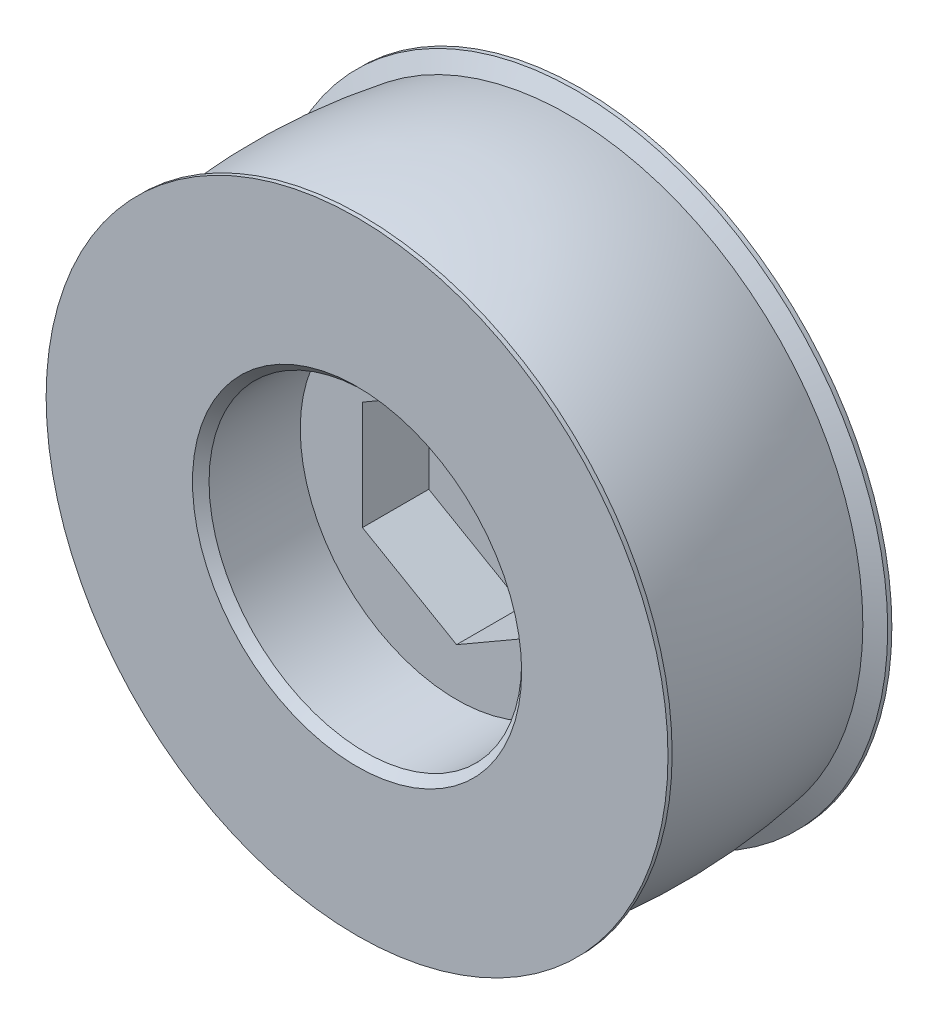
ISO-10303-21;
HEADER;
FILE_DESCRIPTION(('STEP AP214'),'2;1');
FILE_NAME('part.step','',(''),(''),'','','');
FILE_SCHEMA(('AUTOMOTIVE_DESIGN { 1 0 10303 214 1 1 1 1 }'));
ENDSEC;
DATA;
#1=APPLICATION_CONTEXT('core data for automotive mechanical design processes');
#2=APPLICATION_PROTOCOL_DEFINITION('international standard','automotive_design',2000,#1);
#3=PRODUCT_CONTEXT('',#1,'mechanical');
#4=PRODUCT('Part','Part','',(#3));
#5=PRODUCT_RELATED_PRODUCT_CATEGORY('part','',(#4));
#6=PRODUCT_DEFINITION_FORMATION('','',#4);
#7=PRODUCT_DEFINITION_CONTEXT('part definition',#1,'design');
#8=PRODUCT_DEFINITION('design','',#6,#7);
#9=PRODUCT_DEFINITION_SHAPE('','',#8);
#10=(LENGTH_UNIT() NAMED_UNIT(*) SI_UNIT(.MILLI.,.METRE.));
#11=(NAMED_UNIT(*) PLANE_ANGLE_UNIT() SI_UNIT($,.RADIAN.));
#12=(NAMED_UNIT(*) SI_UNIT($,.STERADIAN.) SOLID_ANGLE_UNIT());
#13=UNCERTAINTY_MEASURE_WITH_UNIT(LENGTH_MEASURE(1.E-05),#10,'distance_accuracy_value','');
#14=(GEOMETRIC_REPRESENTATION_CONTEXT(3) GLOBAL_UNCERTAINTY_ASSIGNED_CONTEXT((#13)) GLOBAL_UNIT_ASSIGNED_CONTEXT((#10,
#11,#12)) REPRESENTATION_CONTEXT('',''));
#15=CARTESIAN_POINT('',(0.,0.,0.));
#16=DIRECTION('',(0.,0.,1.));
#17=DIRECTION('',(1.,0.,0.));
#18=AXIS2_PLACEMENT_3D('',#15,#16,#17);
#19=CARTESIAN_POINT('',(0.,-8.,27.));
#20=DIRECTION('',(0.,0.,-1.));
#21=DIRECTION('',(-1.,0.,0.));
#22=AXIS2_PLACEMENT_3D('',#19,#20,#21);
#23=CYLINDRICAL_SURFACE('',#22,1.25);
#24=CARTESIAN_POINT('',(0.,-8.,7.));
#25=DIRECTION('',(0.,0.,1.));
#26=DIRECTION('',(1.,0.,0.));
#27=AXIS2_PLACEMENT_3D('',#24,#25,#26);
#28=CIRCLE('',#27,1.25);
#29=CARTESIAN_POINT('',(1.24999999999992,-8.,7.));
#30=VERTEX_POINT('',#29);
#31=EDGE_CURVE('E160',#30,#30,#28,.T.);
#32=ORIENTED_EDGE('',*,*,#31,.T.);
#33=EDGE_LOOP('',(#32));
#34=FACE_BOUND('',#33,.T.);
#35=CARTESIAN_POINT('',(0.,-8.,4.));
#36=DIRECTION('',(0.,0.,-1.));
#37=DIRECTION('',(-1.,0.,0.));
#38=AXIS2_PLACEMENT_3D('',#35,#36,#37);
#39=CIRCLE('',#38,1.25);
#40=CARTESIAN_POINT('',(-1.25000000000008,-8.,4.));
#41=VERTEX_POINT('',#40);
#42=EDGE_CURVE('E39',#41,#41,#39,.F.);
#43=ORIENTED_EDGE('',*,*,#42,.F.);
#44=EDGE_LOOP('',(#43));
#45=FACE_BOUND('',#44,.T.);
#46=ADVANCED_FACE('F35',(#34,#45),#23,.F.);
#47=CARTESIAN_POINT('',(-6.92820323027551,4.,27.));
#48=DIRECTION('',(0.,0.,-1.));
#49=DIRECTION('',(-1.,0.,0.));
#50=AXIS2_PLACEMENT_3D('',#47,#48,#49);
#51=CYLINDRICAL_SURFACE('',#50,1.25);
#52=CARTESIAN_POINT('',(-6.92820323027551,4.,7.));
#53=DIRECTION('',(0.,0.,1.));
#54=DIRECTION('',(1.,0.,0.));
#55=AXIS2_PLACEMENT_3D('',#52,#53,#54);
#56=CIRCLE('',#55,1.25);
#57=CARTESIAN_POINT('',(-5.67820323027551,4.,7.));
#58=VERTEX_POINT('',#57);
#59=EDGE_CURVE('E159',#58,#58,#56,.T.);
#60=ORIENTED_EDGE('',*,*,#59,.T.);
#61=EDGE_LOOP('',(#60));
#62=FACE_BOUND('',#61,.T.);
#63=CARTESIAN_POINT('',(-6.92820323027551,4.,4.));
#64=DIRECTION('',(0.,0.,-1.));
#65=DIRECTION('',(-1.,0.,0.));
#66=AXIS2_PLACEMENT_3D('',#63,#64,#65);
#67=CIRCLE('',#66,1.25);
#68=CARTESIAN_POINT('',(-8.17820323027551,4.,4.));
#69=VERTEX_POINT('',#68);
#70=EDGE_CURVE('E168',#69,#69,#67,.F.);
#71=ORIENTED_EDGE('',*,*,#70,.F.);
#72=EDGE_LOOP('',(#71));
#73=FACE_BOUND('',#72,.T.);
#74=ADVANCED_FACE('F230',(#62,#73),#51,.F.);
#75=CARTESIAN_POINT('',(6.92820323027553,3.99999999999996,27.));
#76=DIRECTION('',(0.,0.,-1.));
#77=DIRECTION('',(-1.,0.,0.));
#78=AXIS2_PLACEMENT_3D('',#75,#76,#77);
#79=CYLINDRICAL_SURFACE('',#78,1.25);
#80=CARTESIAN_POINT('',(6.92820323027553,3.99999999999996,7.));
#81=DIRECTION('',(0.,0.,1.));
#82=DIRECTION('',(1.,0.,0.));
#83=AXIS2_PLACEMENT_3D('',#80,#81,#82);
#84=CIRCLE('',#83,1.25);
#85=CARTESIAN_POINT('',(8.17820323027553,3.99999999999996,7.));
#86=VERTEX_POINT('',#85);
#87=EDGE_CURVE('E155',#86,#86,#84,.T.);
#88=ORIENTED_EDGE('',*,*,#87,.T.);
#89=EDGE_LOOP('',(#88));
#90=FACE_BOUND('',#89,.T.);
#91=CARTESIAN_POINT('',(6.92820323027553,3.99999999999996,4.));
#92=DIRECTION('',(0.,0.,-1.));
#93=DIRECTION('',(-1.,0.,0.));
#94=AXIS2_PLACEMENT_3D('',#91,#92,#93);
#95=CIRCLE('',#94,1.25);
#96=CARTESIAN_POINT('',(5.67820323027553,3.99999999999996,4.));
#97=VERTEX_POINT('',#96);
#98=EDGE_CURVE('E163',#97,#97,#95,.F.);
#99=ORIENTED_EDGE('',*,*,#98,.F.);
#100=EDGE_LOOP('',(#99));
#101=FACE_BOUND('',#100,.T.);
#102=ADVANCED_FACE('F236',(#90,#101),#79,.F.);
#103=CARTESIAN_POINT('',(0.,0.,15.));
#104=DIRECTION('',(0.,0.,-1.));
#105=DIRECTION('',(-1.,0.,0.));
#106=AXIS2_PLACEMENT_3D('',#103,#104,#105);
#107=CYLINDRICAL_SURFACE('',#106,37.5);
#108=CARTESIAN_POINT('',(0.,0.,26.5));
#109=DIRECTION('',(0.,0.,-1.));
#110=DIRECTION('',(-1.,0.,0.));
#111=AXIS2_PLACEMENT_3D('',#108,#109,#110);
#112=CIRCLE('',#111,37.5);
#113=CARTESIAN_POINT('',(-37.5,0.,26.5));
#114=VERTEX_POINT('',#113);
#115=EDGE_CURVE('E201',#114,#114,#112,.T.);
#116=ORIENTED_EDGE('',*,*,#115,.F.);
#117=EDGE_LOOP('',(#116));
#118=FACE_BOUND('',#117,.T.);
#119=CARTESIAN_POINT('',(0.,0.,27.));
#120=DIRECTION('',(0.,0.,1.));
#121=DIRECTION('',(1.,0.,0.));
#122=AXIS2_PLACEMENT_3D('',#119,#120,#121);
#123=CIRCLE('',#122,37.5);
#124=CARTESIAN_POINT('',(37.5,0.,27.));
#125=VERTEX_POINT('',#124);
#126=EDGE_CURVE('E139',#125,#125,#123,.T.);
#127=ORIENTED_EDGE('',*,*,#126,.F.);
#128=EDGE_LOOP('',(#127));
#129=FACE_BOUND('',#128,.T.);
#130=ADVANCED_FACE('F244',(#118,#129),#107,.T.);
#131=CARTESIAN_POINT('',(0.,0.,15.));
#132=DIRECTION('',(0.,0.,-1.));
#133=DIRECTION('',(-1.,0.,0.));
#134=AXIS2_PLACEMENT_3D('',#131,#132,#133);
#135=CYLINDRICAL_SURFACE('',#134,3.25);
#136=CARTESIAN_POINT('',(0.,0.,0.));
#137=DIRECTION('',(0.,0.,1.));
#138=DIRECTION('',(1.,0.,0.));
#139=AXIS2_PLACEMENT_3D('',#136,#137,#138);
#140=CIRCLE('',#139,3.25);
#141=CARTESIAN_POINT('',(3.25,0.,0.));
#142=VERTEX_POINT('',#141);
#143=EDGE_CURVE('E142',#142,#142,#140,.T.);
#144=ORIENTED_EDGE('',*,*,#143,.F.);
#145=EDGE_LOOP('',(#144));
#146=FACE_BOUND('',#145,.T.);
#147=CARTESIAN_POINT('',(0.,0.,7.));
#148=DIRECTION('',(0.,0.,1.));
#149=DIRECTION('',(1.,0.,0.));
#150=AXIS2_PLACEMENT_3D('',#147,#148,#149);
#151=CIRCLE('',#150,3.25);
#152=CARTESIAN_POINT('',(3.25,0.,7.));
#153=VERTEX_POINT('',#152);
#154=EDGE_CURVE('E138',#153,#153,#151,.T.);
#155=ORIENTED_EDGE('',*,*,#154,.T.);
#156=EDGE_LOOP('',(#155));
#157=FACE_BOUND('',#156,.T.);
#158=ADVANCED_FACE('F281',(#146,#157),#135,.F.);
#159=CARTESIAN_POINT('',(0.,0.,15.));
#160=DIRECTION('',(0.,0.,1.));
#161=DIRECTION('',(1.,0.,0.));
#162=AXIS2_PLACEMENT_3D('',#159,#160,#161);
#163=PLANE('',#162);
#164=DIRECTION('',(0.866025403784439,0.5,0.));
#165=VECTOR('',#164,1.);
#166=CARTESIAN_POINT('',(0.,-13.1058511106045,15.));
#167=LINE('',#166,#165);
#168=CARTESIAN_POINT('',(0.,-13.1058511106045,15.));
#169=VERTEX_POINT('',#168);
#170=CARTESIAN_POINT('',(11.35,-6.55292555530226,15.));
#171=VERTEX_POINT('',#170);
#172=EDGE_CURVE('E52',#169,#171,#167,.T.);
#173=ORIENTED_EDGE('',*,*,#172,.F.);
#174=DIRECTION('',(0.866025403784439,-0.5,0.));
#175=VECTOR('',#174,1.);
#176=CARTESIAN_POINT('',(-11.35,-6.55292555530225,15.));
#177=LINE('',#176,#175);
#178=CARTESIAN_POINT('',(-11.35,-6.55292555530225,15.));
#179=VERTEX_POINT('',#178);
#180=EDGE_CURVE('E126',#179,#169,#177,.T.);
#181=ORIENTED_EDGE('',*,*,#180,.F.);
#182=DIRECTION('',(0.,-1.,0.));
#183=VECTOR('',#182,1.);
#184=CARTESIAN_POINT('',(-11.35,6.55292555530226,15.));
#185=LINE('',#184,#183);
#186=CARTESIAN_POINT('',(-11.35,6.55292555530226,15.));
#187=VERTEX_POINT('',#186);
#188=EDGE_CURVE('E120',#187,#179,#185,.T.);
#189=ORIENTED_EDGE('',*,*,#188,.F.);
#190=DIRECTION('',(-0.866025403784439,-0.5,0.));
#191=VECTOR('',#190,1.);
#192=CARTESIAN_POINT('',(0.,13.1058511106045,15.));
#193=LINE('',#192,#191);
#194=CARTESIAN_POINT('',(0.,13.1058511106045,15.));
#195=VERTEX_POINT('',#194);
#196=EDGE_CURVE('E118',#195,#187,#193,.T.);
#197=ORIENTED_EDGE('',*,*,#196,.F.);
#198=DIRECTION('',(-0.866025403784439,0.5,0.));
#199=VECTOR('',#198,1.);
#200=CARTESIAN_POINT('',(11.35,6.55292555530226,15.));
#201=LINE('',#200,#199);
#202=CARTESIAN_POINT('',(11.35,6.55292555530226,15.));
#203=VERTEX_POINT('',#202);
#204=EDGE_CURVE('E103',#203,#195,#201,.T.);
#205=ORIENTED_EDGE('',*,*,#204,.F.);
#206=DIRECTION('',(0.,1.,0.));
#207=VECTOR('',#206,1.);
#208=CARTESIAN_POINT('',(11.35,-6.55292555530226,15.));
#209=LINE('',#208,#207);
#210=EDGE_CURVE('E110',#171,#203,#209,.T.);
#211=ORIENTED_EDGE('',*,*,#210,.F.);
#212=EDGE_LOOP('',(#173,#181,#189,#197,#205,#211));
#213=FACE_BOUND('',#212,.T.);
#214=CARTESIAN_POINT('',(0.,0.,15.));
#215=DIRECTION('',(0.,0.,1.));
#216=DIRECTION('',(1.,0.,0.));
#217=AXIS2_PLACEMENT_3D('',#214,#215,#216);
#218=CIRCLE('',#217,18.85);
#219=CARTESIAN_POINT('',(18.85,0.,15.));
#220=VERTEX_POINT('',#219);
#221=EDGE_CURVE('E148',#220,#220,#218,.F.);
#222=ORIENTED_EDGE('',*,*,#221,.F.);
#223=EDGE_LOOP('',(#222));
#224=FACE_BOUND('',#223,.T.);
#225=ADVANCED_FACE('F114',(#213,#224),#163,.T.);
#226=CARTESIAN_POINT('',(0.,0.,0.));
#227=DIRECTION('',(0.,0.,1.));
#228=DIRECTION('',(1.,0.,0.));
#229=AXIS2_PLACEMENT_3D('',#226,#227,#228);
#230=PLANE('',#229);
#231=CARTESIAN_POINT('',(-6.92820323027551,4.,0.));
#232=DIRECTION('',(0.,0.,-1.));
#233=DIRECTION('',(-1.,0.,0.));
#234=AXIS2_PLACEMENT_3D('',#231,#232,#233);
#235=CIRCLE('',#234,4.25);
#236=CARTESIAN_POINT('',(-11.1782032302755,4.,0.));
#237=VERTEX_POINT('',#236);
#238=EDGE_CURVE('E176',#237,#237,#235,.T.);
#239=ORIENTED_EDGE('',*,*,#238,.F.);
#240=EDGE_LOOP('',(#239));
#241=FACE_BOUND('',#240,.T.);
#242=CARTESIAN_POINT('',(0.,-8.,0.));
#243=DIRECTION('',(0.,0.,-1.));
#244=DIRECTION('',(-1.,0.,0.));
#245=AXIS2_PLACEMENT_3D('',#242,#243,#244);
#246=CIRCLE('',#245,4.25);
#247=CARTESIAN_POINT('',(-4.25000000000008,-8.,0.));
#248=VERTEX_POINT('',#247);
#249=EDGE_CURVE('E186',#248,#248,#246,.T.);
#250=ORIENTED_EDGE('',*,*,#249,.F.);
#251=EDGE_LOOP('',(#250));
#252=FACE_BOUND('',#251,.T.);
#253=CARTESIAN_POINT('',(6.92820323027553,3.99999999999996,0.));
#254=DIRECTION('',(0.,0.,-1.));
#255=DIRECTION('',(-1.,0.,0.));
#256=AXIS2_PLACEMENT_3D('',#253,#254,#255);
#257=CIRCLE('',#256,4.25);
#258=CARTESIAN_POINT('',(2.67820323027553,3.99999999999996,0.));
#259=VERTEX_POINT('',#258);
#260=EDGE_CURVE('E174',#259,#259,#257,.T.);
#261=ORIENTED_EDGE('',*,*,#260,.F.);
#262=EDGE_LOOP('',(#261));
#263=FACE_BOUND('',#262,.T.);
#264=CARTESIAN_POINT('',(0.,0.,0.));
#265=DIRECTION('',(0.,0.,1.));
#266=DIRECTION('',(1.,0.,0.));
#267=AXIS2_PLACEMENT_3D('',#264,#265,#266);
#268=CIRCLE('',#267,37.5);
#269=CARTESIAN_POINT('',(37.5,0.,0.));
#270=VERTEX_POINT('',#269);
#271=EDGE_CURVE('E145',#270,#270,#268,.T.);
#272=ORIENTED_EDGE('',*,*,#271,.F.);
#273=EDGE_LOOP('',(#272));
#274=FACE_BOUND('',#273,.T.);
#275=ORIENTED_EDGE('',*,*,#143,.T.);
#276=EDGE_LOOP('',(#275));
#277=FACE_BOUND('',#276,.T.);
#278=ADVANCED_FACE('F287',(#241,#252,#263,#274,#277),#230,.F.);
#279=CARTESIAN_POINT('',(0.,0.,0.5));
#280=DIRECTION('',(0.,0.,-1.));
#281=DIRECTION('',(-1.,0.,0.));
#282=AXIS2_PLACEMENT_3D('',#279,#280,#281);
#283=CIRCLE('',#282,37.5);
#284=CARTESIAN_POINT('',(-37.5,0.,0.5));
#285=VERTEX_POINT('',#284);
#286=EDGE_CURVE('E198',#285,#285,#283,.T.);
#287=ORIENTED_EDGE('',*,*,#286,.T.);
#288=EDGE_LOOP('',(#287));
#289=FACE_BOUND('',#288,.T.);
#290=ORIENTED_EDGE('',*,*,#271,.T.);
#291=EDGE_LOOP('',(#290));
#292=FACE_BOUND('',#291,.T.);
#293=ADVANCED_FACE('F279',(#289,#292),#107,.T.);
#294=CARTESIAN_POINT('',(0.,0.,27.));
#295=DIRECTION('',(0.,0.,1.));
#296=DIRECTION('',(1.,0.,0.));
#297=AXIS2_PLACEMENT_3D('',#294,#295,#296);
#298=PLANE('',#297);
#299=CARTESIAN_POINT('',(0.,0.,27.));
#300=DIRECTION('',(0.,0.,1.));
#301=DIRECTION('',(1.,0.,0.));
#302=AXIS2_PLACEMENT_3D('',#299,#300,#301);
#303=CIRCLE('',#302,19.85);
#304=CARTESIAN_POINT('',(19.85,0.,27.));
#305=VERTEX_POINT('',#304);
#306=EDGE_CURVE('E12',#305,#305,#303,.F.);
#307=ORIENTED_EDGE('',*,*,#306,.T.);
#308=EDGE_LOOP('',(#307));
#309=FACE_BOUND('',#308,.T.);
#310=ORIENTED_EDGE('',*,*,#126,.T.);
#311=EDGE_LOOP('',(#310));
#312=FACE_BOUND('',#311,.T.);
#313=ADVANCED_FACE('F272',(#309,#312),#298,.T.);
#314=CARTESIAN_POINT('',(0.,0.,27.));
#315=DIRECTION('',(0.,0.,-1.));
#316=DIRECTION('',(-1.,0.,0.));
#317=AXIS2_PLACEMENT_3D('',#314,#315,#316);
#318=CYLINDRICAL_SURFACE('',#317,18.85);
#319=CARTESIAN_POINT('',(0.,0.,26.));
#320=DIRECTION('',(0.,0.,1.));
#321=DIRECTION('',(1.,0.,0.));
#322=AXIS2_PLACEMENT_3D('',#319,#320,#321);
#323=CIRCLE('',#322,18.85);
#324=CARTESIAN_POINT('',(18.85,0.,26.));
#325=VERTEX_POINT('',#324);
#326=EDGE_CURVE('E44',#325,#325,#323,.T.);
#327=ORIENTED_EDGE('',*,*,#326,.T.);
#328=EDGE_LOOP('',(#327));
#329=FACE_BOUND('',#328,.T.);
#330=ORIENTED_EDGE('',*,*,#221,.T.);
#331=EDGE_LOOP('',(#330));
#332=FACE_BOUND('',#331,.T.);
#333=ADVANCED_FACE('F267',(#329,#332),#318,.F.);
#334=CARTESIAN_POINT('',(0.,-13.1058511106045,-34.6748227584992));
#335=DIRECTION('',(0.5,-0.866025403784439,0.));
#336=DIRECTION('',(0.866025403784439,0.5,0.));
#337=AXIS2_PLACEMENT_3D('',#334,#335,#336);
#338=PLANE('',#337);
#339=DIRECTION('',(-0.866025403784439,-0.5,0.));
#340=VECTOR('',#339,1.);
#341=CARTESIAN_POINT('',(0.,-13.1058511106045,7.));
#342=LINE('',#341,#340);
#343=CARTESIAN_POINT('',(11.35,-6.55292555530226,7.));
#344=VERTEX_POINT('',#343);
#345=CARTESIAN_POINT('',(0.,-13.1058511106045,7.));
#346=VERTEX_POINT('',#345);
#347=EDGE_CURVE('E71',#344,#346,#342,.T.);
#348=ORIENTED_EDGE('',*,*,#347,.T.);
#349=DIRECTION('',(0.,0.,1.));
#350=VECTOR('',#349,1.);
#351=CARTESIAN_POINT('',(0.,-13.1058511106045,-34.6748227584992));
#352=LINE('',#351,#350);
#353=EDGE_CURVE('E129',#346,#169,#352,.T.);
#354=ORIENTED_EDGE('',*,*,#353,.T.);
#355=ORIENTED_EDGE('',*,*,#172,.T.);
#356=DIRECTION('',(0.,0.,1.));
#357=VECTOR('',#356,1.);
#358=CARTESIAN_POINT('',(11.35,-6.55292555530226,-34.6748227584992));
#359=LINE('',#358,#357);
#360=EDGE_CURVE('E107',#344,#171,#359,.T.);
#361=ORIENTED_EDGE('',*,*,#360,.F.);
#362=EDGE_LOOP('',(#348,#354,#355,#361));
#363=FACE_BOUND('',#362,.T.);
#364=ADVANCED_FACE('F263',(#363),#338,.F.);
#365=CARTESIAN_POINT('',(-11.35,-6.55292555530225,-34.6748227584992));
#366=DIRECTION('',(-0.5,-0.866025403784439,0.));
#367=DIRECTION('',(0.866025403784439,-0.5,0.));
#368=AXIS2_PLACEMENT_3D('',#365,#366,#367);
#369=PLANE('',#368);
#370=DIRECTION('',(-0.866025403784439,0.5,0.));
#371=VECTOR('',#370,1.);
#372=CARTESIAN_POINT('',(-11.35,-6.55292555530225,7.));
#373=LINE('',#372,#371);
#374=CARTESIAN_POINT('',(-11.35,-6.55292555530225,7.));
#375=VERTEX_POINT('',#374);
#376=EDGE_CURVE('E208',#346,#375,#373,.T.);
#377=ORIENTED_EDGE('',*,*,#376,.T.);
#378=DIRECTION('',(0.,0.,1.));
#379=VECTOR('',#378,1.);
#380=CARTESIAN_POINT('',(-11.35,-6.55292555530225,-34.6748227584992));
#381=LINE('',#380,#379);
#382=EDGE_CURVE('E131',#375,#179,#381,.T.);
#383=ORIENTED_EDGE('',*,*,#382,.T.);
#384=ORIENTED_EDGE('',*,*,#180,.T.);
#385=ORIENTED_EDGE('',*,*,#353,.F.);
#386=EDGE_LOOP('',(#377,#383,#384,#385));
#387=FACE_BOUND('',#386,.T.);
#388=ADVANCED_FACE('F213',(#387),#369,.F.);
#389=CARTESIAN_POINT('',(-11.35,6.55292555530226,-34.6748227584992));
#390=DIRECTION('',(-1.,0.,0.));
#391=DIRECTION('',(0.,-1.,0.));
#392=AXIS2_PLACEMENT_3D('',#389,#390,#391);
#393=PLANE('',#392);
#394=DIRECTION('',(0.,1.,0.));
#395=VECTOR('',#394,1.);
#396=CARTESIAN_POINT('',(-11.35,6.55292555530226,7.));
#397=LINE('',#396,#395);
#398=CARTESIAN_POINT('',(-11.35,6.55292555530226,7.));
#399=VERTEX_POINT('',#398);
#400=EDGE_CURVE('E206',#375,#399,#397,.T.);
#401=ORIENTED_EDGE('',*,*,#400,.T.);
#402=DIRECTION('',(0.,0.,1.));
#403=VECTOR('',#402,1.);
#404=CARTESIAN_POINT('',(-11.35,6.55292555530226,-34.6748227584992));
#405=LINE('',#404,#403);
#406=EDGE_CURVE('E133',#399,#187,#405,.T.);
#407=ORIENTED_EDGE('',*,*,#406,.T.);
#408=ORIENTED_EDGE('',*,*,#188,.T.);
#409=ORIENTED_EDGE('',*,*,#382,.F.);
#410=EDGE_LOOP('',(#401,#407,#408,#409));
#411=FACE_BOUND('',#410,.T.);
#412=ADVANCED_FACE('F218',(#411),#393,.F.);
#413=CARTESIAN_POINT('',(0.,13.1058511106045,-34.6748227584992));
#414=DIRECTION('',(-0.5,0.866025403784439,0.));
#415=DIRECTION('',(-0.866025403784439,-0.5,0.));
#416=AXIS2_PLACEMENT_3D('',#413,#414,#415);
#417=PLANE('',#416);
#418=DIRECTION('',(0.866025403784439,0.5,0.));
#419=VECTOR('',#418,1.);
#420=CARTESIAN_POINT('',(0.,13.1058511106045,7.));
#421=LINE('',#420,#419);
#422=CARTESIAN_POINT('',(0.,13.1058511106045,7.));
#423=VERTEX_POINT('',#422);
#424=EDGE_CURVE('E61',#399,#423,#421,.T.);
#425=ORIENTED_EDGE('',*,*,#424,.T.);
#426=DIRECTION('',(0.,0.,1.));
#427=VECTOR('',#426,1.);
#428=CARTESIAN_POINT('',(0.,13.1058511106045,-34.6748227584992));
#429=LINE('',#428,#427);
#430=EDGE_CURVE('E106',#423,#195,#429,.T.);
#431=ORIENTED_EDGE('',*,*,#430,.T.);
#432=ORIENTED_EDGE('',*,*,#196,.T.);
#433=ORIENTED_EDGE('',*,*,#406,.F.);
#434=EDGE_LOOP('',(#425,#431,#432,#433));
#435=FACE_BOUND('',#434,.T.);
#436=ADVANCED_FACE('F220',(#435),#417,.F.);
#437=CARTESIAN_POINT('',(11.35,6.55292555530226,-34.6748227584992));
#438=DIRECTION('',(0.5,0.866025403784439,0.));
#439=DIRECTION('',(-0.866025403784439,0.5,0.));
#440=AXIS2_PLACEMENT_3D('',#437,#438,#439);
#441=PLANE('',#440);
#442=DIRECTION('',(0.866025403784439,-0.5,0.));
#443=VECTOR('',#442,1.);
#444=CARTESIAN_POINT('',(11.35,6.55292555530226,7.));
#445=LINE('',#444,#443);
#446=CARTESIAN_POINT('',(11.35,6.55292555530226,7.));
#447=VERTEX_POINT('',#446);
#448=EDGE_CURVE('E105',#423,#447,#445,.T.);
#449=ORIENTED_EDGE('',*,*,#448,.T.);
#450=DIRECTION('',(0.,0.,1.));
#451=VECTOR('',#450,1.);
#452=CARTESIAN_POINT('',(11.35,6.55292555530226,-34.6748227584992));
#453=LINE('',#452,#451);
#454=EDGE_CURVE('E98',#447,#203,#453,.T.);
#455=ORIENTED_EDGE('',*,*,#454,.T.);
#456=ORIENTED_EDGE('',*,*,#204,.T.);
#457=ORIENTED_EDGE('',*,*,#430,.F.);
#458=EDGE_LOOP('',(#449,#455,#456,#457));
#459=FACE_BOUND('',#458,.T.);
#460=ADVANCED_FACE('F100',(#459),#441,.F.);
#461=CARTESIAN_POINT('',(11.35,-6.55292555530226,-34.6748227584992));
#462=DIRECTION('',(1.,0.,0.));
#463=DIRECTION('',(0.,1.,0.));
#464=AXIS2_PLACEMENT_3D('',#461,#462,#463);
#465=PLANE('',#464);
#466=DIRECTION('',(0.,-1.,0.));
#467=VECTOR('',#466,1.);
#468=CARTESIAN_POINT('',(11.35,-6.55292555530226,7.));
#469=LINE('',#468,#467);
#470=EDGE_CURVE('E80',#447,#344,#469,.T.);
#471=ORIENTED_EDGE('',*,*,#470,.T.);
#472=ORIENTED_EDGE('',*,*,#360,.T.);
#473=ORIENTED_EDGE('',*,*,#210,.T.);
#474=ORIENTED_EDGE('',*,*,#454,.F.);
#475=EDGE_LOOP('',(#471,#472,#473,#474));
#476=FACE_BOUND('',#475,.T.);
#477=ADVANCED_FACE('F111',(#476),#465,.F.);
#478=CARTESIAN_POINT('',(0.,0.,7.));
#479=DIRECTION('',(0.,0.,1.));
#480=DIRECTION('',(1.,0.,0.));
#481=AXIS2_PLACEMENT_3D('',#478,#479,#480);
#482=PLANE('',#481);
#483=ORIENTED_EDGE('',*,*,#59,.F.);
#484=EDGE_LOOP('',(#483));
#485=FACE_BOUND('',#484,.T.);
#486=ORIENTED_EDGE('',*,*,#31,.F.);
#487=EDGE_LOOP('',(#486));
#488=FACE_BOUND('',#487,.T.);
#489=ORIENTED_EDGE('',*,*,#87,.F.);
#490=EDGE_LOOP('',(#489));
#491=FACE_BOUND('',#490,.T.);
#492=ORIENTED_EDGE('',*,*,#154,.F.);
#493=EDGE_LOOP('',(#492));
#494=FACE_BOUND('',#493,.T.);
#495=ORIENTED_EDGE('',*,*,#347,.F.);
#496=ORIENTED_EDGE('',*,*,#470,.F.);
#497=ORIENTED_EDGE('',*,*,#448,.F.);
#498=ORIENTED_EDGE('',*,*,#424,.F.);
#499=ORIENTED_EDGE('',*,*,#400,.F.);
#500=ORIENTED_EDGE('',*,*,#376,.F.);
#501=EDGE_LOOP('',(#495,#496,#497,#498,#499,#500));
#502=FACE_BOUND('',#501,.T.);
#503=ADVANCED_FACE('F216',(#485,#488,#491,#494,#502),#482,.T.);
#504=CARTESIAN_POINT('',(0.,0.,26.));
#505=DIRECTION('',(0.,0.,1.));
#506=DIRECTION('',(1.,0.,0.));
#507=AXIS2_PLACEMENT_3D('',#504,#505,#506);
#508=CONICAL_SURFACE('',#507,18.85,0.78539816339745);
#509=ORIENTED_EDGE('',*,*,#306,.F.);
#510=EDGE_LOOP('',(#509));
#511=FACE_BOUND('',#510,.T.);
#512=ORIENTED_EDGE('',*,*,#326,.F.);
#513=EDGE_LOOP('',(#512));
#514=FACE_BOUND('',#513,.T.);
#515=ADVANCED_FACE('F37',(#511,#514),#508,.F.);
#516=CARTESIAN_POINT('',(0.,0.,26.5));
#517=DIRECTION('',(0.,0.,1.));
#518=DIRECTION('',(1.,0.,0.));
#519=AXIS2_PLACEMENT_3D('',#516,#517,#518);
#520=CONICAL_SURFACE('',#519,37.5,1.10714871779409);
#521=CARTESIAN_POINT('',(0.,0.,25.5));
#522=DIRECTION('',(0.,0.,-1.));
#523=DIRECTION('',(-1.,0.,0.));
#524=AXIS2_PLACEMENT_3D('',#521,#522,#523);
#525=CIRCLE('',#524,35.5);
#526=CARTESIAN_POINT('',(-35.5,0.,25.5));
#527=VERTEX_POINT('',#526);
#528=EDGE_CURVE('E158',#527,#527,#525,.T.);
#529=ORIENTED_EDGE('',*,*,#528,.F.);
#530=EDGE_LOOP('',(#529));
#531=FACE_BOUND('',#530,.T.);
#532=ORIENTED_EDGE('',*,*,#115,.T.);
#533=EDGE_LOOP('',(#532));
#534=FACE_BOUND('',#533,.T.);
#535=ADVANCED_FACE('F254',(#531,#534),#520,.T.);
#536=CARTESIAN_POINT('',(0.,0.,1.5));
#537=DIRECTION('',(0.,0.,-1.));
#538=DIRECTION('',(-1.,0.,0.));
#539=AXIS2_PLACEMENT_3D('',#536,#537,#538);
#540=CONICAL_SURFACE('',#539,35.5,1.10714871779409);
#541=ORIENTED_EDGE('',*,*,#286,.F.);
#542=EDGE_LOOP('',(#541));
#543=FACE_BOUND('',#542,.T.);
#544=CARTESIAN_POINT('',(0.,0.,1.5));
#545=DIRECTION('',(0.,0.,-1.));
#546=DIRECTION('',(-1.,0.,0.));
#547=AXIS2_PLACEMENT_3D('',#544,#545,#546);
#548=CIRCLE('',#547,35.5);
#549=CARTESIAN_POINT('',(-35.5,0.,1.5));
#550=VERTEX_POINT('',#549);
#551=EDGE_CURVE('E195',#550,#550,#548,.T.);
#552=ORIENTED_EDGE('',*,*,#551,.T.);
#553=EDGE_LOOP('',(#552));
#554=FACE_BOUND('',#553,.T.);
#555=ADVANCED_FACE('F250',(#543,#554),#540,.T.);
#556=CARTESIAN_POINT('',(0.,0.,13.5));
#557=DIRECTION('',(0.,0.,-1.));
#558=DIRECTION('',(-1.,0.,0.));
#559=AXIS2_PLACEMENT_3D('',#556,#557,#558);
#560=DEGENERATE_TOROIDAL_SURFACE('',#559,35.9999999999999,72.4999999999999,.F.);
#561=ORIENTED_EDGE('',*,*,#551,.F.);
#562=EDGE_LOOP('',(#561));
#563=FACE_BOUND('',#562,.T.);
#564=ORIENTED_EDGE('',*,*,#528,.T.);
#565=EDGE_LOOP('',(#564));
#566=FACE_BOUND('',#565,.T.);
#567=ADVANCED_FACE('F246',(#563,#566),#560,.F.);
#568=CARTESIAN_POINT('',(6.92820323027553,3.99999999999996,4.));
#569=DIRECTION('',(0.,0.,-1.));
#570=DIRECTION('',(-1.,0.,0.));
#571=AXIS2_PLACEMENT_3D('',#568,#569,#570);
#572=PLANE('',#571);
#573=CARTESIAN_POINT('',(6.92820323027553,3.99999999999996,4.));
#574=DIRECTION('',(0.,0.,-1.));
#575=DIRECTION('',(-1.,0.,0.));
#576=AXIS2_PLACEMENT_3D('',#573,#574,#575);
#577=CIRCLE('',#576,4.25);
#578=CARTESIAN_POINT('',(2.67820323027553,3.99999999999996,4.));
#579=VERTEX_POINT('',#578);
#580=EDGE_CURVE('E167',#579,#579,#577,.T.);
#581=ORIENTED_EDGE('',*,*,#580,.T.);
#582=EDGE_LOOP('',(#581));
#583=FACE_BOUND('',#582,.T.);
#584=ORIENTED_EDGE('',*,*,#98,.T.);
#585=EDGE_LOOP('',(#584));
#586=FACE_BOUND('',#585,.T.);
#587=ADVANCED_FACE('F249',(#583,#586),#572,.T.);
#588=CARTESIAN_POINT('',(6.92820323027553,3.99999999999996,4.));
#589=DIRECTION('',(0.,0.,-1.));
#590=DIRECTION('',(-1.,0.,0.));
#591=AXIS2_PLACEMENT_3D('',#588,#589,#590);
#592=CYLINDRICAL_SURFACE('',#591,4.25);
#593=ORIENTED_EDGE('',*,*,#580,.F.);
#594=EDGE_LOOP('',(#593));
#595=FACE_BOUND('',#594,.T.);
#596=ORIENTED_EDGE('',*,*,#260,.T.);
#597=EDGE_LOOP('',(#596));
#598=FACE_BOUND('',#597,.T.);
#599=ADVANCED_FACE('F332',(#595,#598),#592,.F.);
#600=CARTESIAN_POINT('',(-6.92820323027551,4.,4.));
#601=DIRECTION('',(0.,0.,-1.));
#602=DIRECTION('',(-1.,0.,0.));
#603=AXIS2_PLACEMENT_3D('',#600,#601,#602);
#604=PLANE('',#603);
#605=CARTESIAN_POINT('',(-6.92820323027551,4.,4.));
#606=DIRECTION('',(0.,0.,-1.));
#607=DIRECTION('',(-1.,0.,0.));
#608=AXIS2_PLACEMENT_3D('',#605,#606,#607);
#609=CIRCLE('',#608,4.25);
#610=CARTESIAN_POINT('',(-11.1782032302755,4.,4.));
#611=VERTEX_POINT('',#610);
#612=EDGE_CURVE('E170',#611,#611,#609,.T.);
#613=ORIENTED_EDGE('',*,*,#612,.T.);
#614=EDGE_LOOP('',(#613));
#615=FACE_BOUND('',#614,.T.);
#616=ORIENTED_EDGE('',*,*,#70,.T.);
#617=EDGE_LOOP('',(#616));
#618=FACE_BOUND('',#617,.T.);
#619=ADVANCED_FACE('F343',(#615,#618),#604,.T.);
#620=CARTESIAN_POINT('',(-6.92820323027551,4.,4.));
#621=DIRECTION('',(0.,0.,-1.));
#622=DIRECTION('',(-1.,0.,0.));
#623=AXIS2_PLACEMENT_3D('',#620,#621,#622);
#624=CYLINDRICAL_SURFACE('',#623,4.25);
#625=ORIENTED_EDGE('',*,*,#612,.F.);
#626=EDGE_LOOP('',(#625));
#627=FACE_BOUND('',#626,.T.);
#628=ORIENTED_EDGE('',*,*,#238,.T.);
#629=EDGE_LOOP('',(#628));
#630=FACE_BOUND('',#629,.T.);
#631=ADVANCED_FACE('F352',(#627,#630),#624,.F.);
#632=CARTESIAN_POINT('',(0.,-8.,4.));
#633=DIRECTION('',(0.,0.,-1.));
#634=DIRECTION('',(-1.,0.,0.));
#635=AXIS2_PLACEMENT_3D('',#632,#633,#634);
#636=PLANE('',#635);
#637=CARTESIAN_POINT('',(0.,-8.,4.));
#638=DIRECTION('',(0.,0.,-1.));
#639=DIRECTION('',(-1.,0.,0.));
#640=AXIS2_PLACEMENT_3D('',#637,#638,#639);
#641=CIRCLE('',#640,4.25);
#642=CARTESIAN_POINT('',(-4.25000000000008,-8.,4.));
#643=VERTEX_POINT('',#642);
#644=EDGE_CURVE('E181',#643,#643,#641,.T.);
#645=ORIENTED_EDGE('',*,*,#644,.T.);
#646=EDGE_LOOP('',(#645));
#647=FACE_BOUND('',#646,.T.);
#648=ORIENTED_EDGE('',*,*,#42,.T.);
#649=EDGE_LOOP('',(#648));
#650=FACE_BOUND('',#649,.T.);
#651=ADVANCED_FACE('F361',(#647,#650),#636,.T.);
#652=CARTESIAN_POINT('',(0.,-8.,4.));
#653=DIRECTION('',(0.,0.,-1.));
#654=DIRECTION('',(-1.,0.,0.));
#655=AXIS2_PLACEMENT_3D('',#652,#653,#654);
#656=CYLINDRICAL_SURFACE('',#655,4.25);
#657=ORIENTED_EDGE('',*,*,#644,.F.);
#658=EDGE_LOOP('',(#657));
#659=FACE_BOUND('',#658,.T.);
#660=ORIENTED_EDGE('',*,*,#249,.T.);
#661=EDGE_LOOP('',(#660));
#662=FACE_BOUND('',#661,.T.);
#663=ADVANCED_FACE('F371',(#659,#662),#656,.F.);
#664=CLOSED_SHELL('',(#46,#74,#102,#130,#158,#225,#278,#293,#313,#333,#364,#388,#412,#436,#460,
#477,#503,#515,#535,#555,#567,#587,#599,#619,#631,#651,#663));
#665=MANIFOLD_SOLID_BREP('B2',#664);
#666=ADVANCED_BREP_SHAPE_REPRESENTATION('',(#18,#665),#14);
#667=SHAPE_DEFINITION_REPRESENTATION(#9,#666);
ENDSEC;
END-ISO-10303-21;
